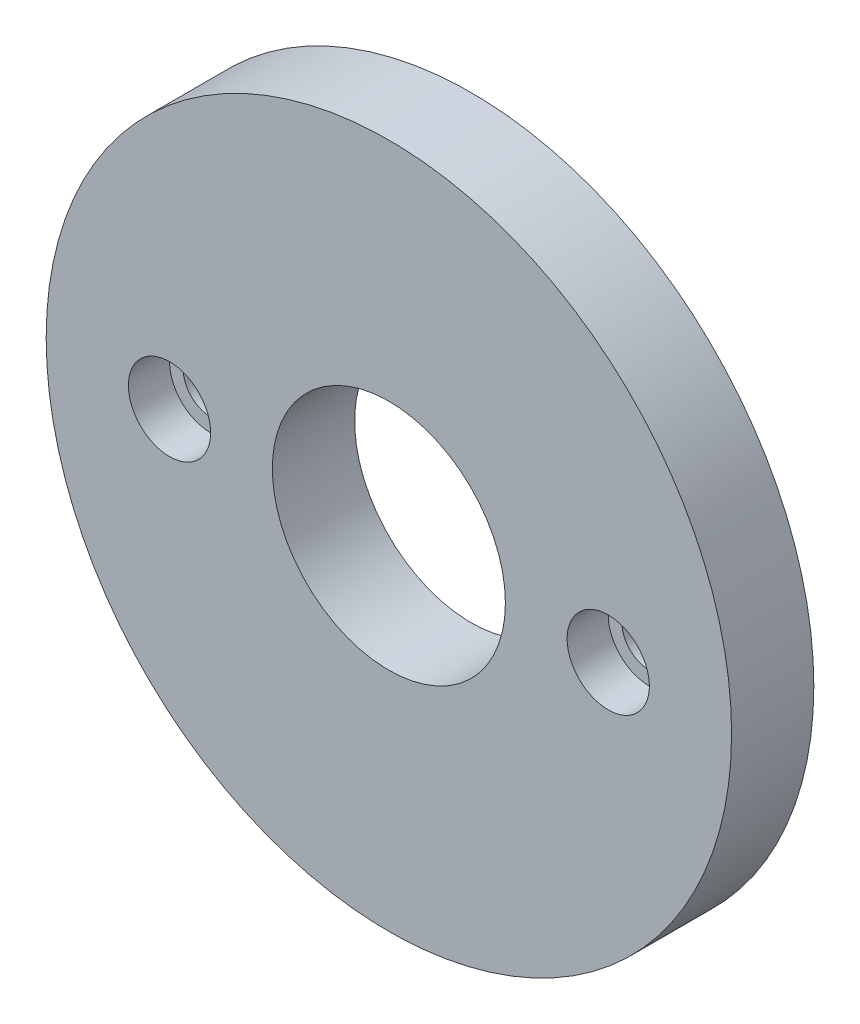
ISO-10303-21;
HEADER;
FILE_DESCRIPTION(('STEP AP214'),'2;1');
FILE_NAME('part.step','',(''),(''),'','','');
FILE_SCHEMA(('AUTOMOTIVE_DESIGN { 1 0 10303 214 1 1 1 1 }'));
ENDSEC;
DATA;
#1=APPLICATION_CONTEXT('core data for automotive mechanical design processes');
#2=APPLICATION_PROTOCOL_DEFINITION('international standard','automotive_design',2000,#1);
#3=PRODUCT_CONTEXT('',#1,'mechanical');
#4=PRODUCT('Part','Part','',(#3));
#5=PRODUCT_RELATED_PRODUCT_CATEGORY('part','',(#4));
#6=PRODUCT_DEFINITION_FORMATION('','',#4);
#7=PRODUCT_DEFINITION_CONTEXT('part definition',#1,'design');
#8=PRODUCT_DEFINITION('design','',#6,#7);
#9=PRODUCT_DEFINITION_SHAPE('','',#8);
#10=(LENGTH_UNIT() NAMED_UNIT(*) SI_UNIT(.MILLI.,.METRE.));
#11=(NAMED_UNIT(*) PLANE_ANGLE_UNIT() SI_UNIT($,.RADIAN.));
#12=(NAMED_UNIT(*) SI_UNIT($,.STERADIAN.) SOLID_ANGLE_UNIT());
#13=UNCERTAINTY_MEASURE_WITH_UNIT(LENGTH_MEASURE(1.E-05),#10,'distance_accuracy_value','');
#14=(GEOMETRIC_REPRESENTATION_CONTEXT(3) GLOBAL_UNCERTAINTY_ASSIGNED_CONTEXT((#13)) GLOBAL_UNIT_ASSIGNED_CONTEXT((#10,
#11,#12)) REPRESENTATION_CONTEXT('',''));
#15=CARTESIAN_POINT('',(0.,0.,0.));
#16=DIRECTION('',(0.,0.,1.));
#17=DIRECTION('',(1.,0.,0.));
#18=AXIS2_PLACEMENT_3D('',#15,#16,#17);
#19=CARTESIAN_POINT('',(0.,0.,5.99999999999999));
#20=DIRECTION('',(0.,0.,1.));
#21=DIRECTION('',(1.,0.,0.));
#22=AXIS2_PLACEMENT_3D('',#19,#20,#21);
#23=PLANE('',#22);
#24=CARTESIAN_POINT('',(-16.,0.,5.99999999999999));
#25=DIRECTION('',(0.,0.,1.));
#26=DIRECTION('',(1.,0.,0.));
#27=AXIS2_PLACEMENT_3D('',#24,#25,#26);
#28=CIRCLE('',#27,3.);
#29=CARTESIAN_POINT('',(-13.,0.,5.99999999999999));
#30=VERTEX_POINT('',#29);
#31=EDGE_CURVE('E72',#30,#30,#28,.T.);
#32=ORIENTED_EDGE('',*,*,#31,.F.);
#33=EDGE_LOOP('',(#32));
#34=FACE_BOUND('',#33,.T.);
#35=CARTESIAN_POINT('',(16.,0.,5.99999999999999));
#36=DIRECTION('',(0.,0.,1.));
#37=DIRECTION('',(-1.,0.,0.));
#38=AXIS2_PLACEMENT_3D('',#35,#36,#37);
#39=CIRCLE('',#38,2.99999999999999);
#40=CARTESIAN_POINT('',(13.,0.,5.99999999999999));
#41=VERTEX_POINT('',#40);
#42=EDGE_CURVE('E75',#41,#41,#39,.T.);
#43=ORIENTED_EDGE('',*,*,#42,.F.);
#44=EDGE_LOOP('',(#43));
#45=FACE_BOUND('',#44,.T.);
#46=CARTESIAN_POINT('',(0.,0.,5.99999999999999));
#47=DIRECTION('',(0.,0.,1.));
#48=DIRECTION('',(1.,0.,0.));
#49=AXIS2_PLACEMENT_3D('',#46,#47,#48);
#50=CIRCLE('',#49,25.);
#51=CARTESIAN_POINT('',(25.,0.,5.99999999999999));
#52=VERTEX_POINT('',#51);
#53=EDGE_CURVE('E10',#52,#52,#50,.T.);
#54=ORIENTED_EDGE('',*,*,#53,.T.);
#55=EDGE_LOOP('',(#54));
#56=FACE_BOUND('',#55,.T.);
#57=CARTESIAN_POINT('',(0.,0.,5.99999999999999));
#58=DIRECTION('',(0.,0.,1.));
#59=DIRECTION('',(1.,0.,0.));
#60=AXIS2_PLACEMENT_3D('',#57,#58,#59);
#61=CIRCLE('',#60,8.5);
#62=CARTESIAN_POINT('',(8.5,0.,5.99999999999999));
#63=VERTEX_POINT('',#62);
#64=EDGE_CURVE('E49',#63,#63,#61,.T.);
#65=ORIENTED_EDGE('',*,*,#64,.F.);
#66=EDGE_LOOP('',(#65));
#67=FACE_BOUND('',#66,.T.);
#68=ADVANCED_FACE('F36',(#34,#45,#56,#67),#23,.T.);
#69=CARTESIAN_POINT('',(0.,0.,0.));
#70=DIRECTION('',(0.,0.,1.));
#71=DIRECTION('',(1.,0.,0.));
#72=AXIS2_PLACEMENT_3D('',#69,#70,#71);
#73=PLANE('',#72);
#74=CARTESIAN_POINT('',(-16.,0.,0.));
#75=DIRECTION('',(0.,0.,1.));
#76=DIRECTION('',(1.,0.,0.));
#77=AXIS2_PLACEMENT_3D('',#74,#75,#76);
#78=CIRCLE('',#77,2.);
#79=CARTESIAN_POINT('',(-14.,0.,0.));
#80=VERTEX_POINT('',#79);
#81=EDGE_CURVE('E56',#80,#80,#78,.T.);
#82=ORIENTED_EDGE('',*,*,#81,.T.);
#83=EDGE_LOOP('',(#82));
#84=FACE_BOUND('',#83,.T.);
#85=CARTESIAN_POINT('',(16.,0.,0.));
#86=DIRECTION('',(0.,0.,1.));
#87=DIRECTION('',(1.,0.,0.));
#88=AXIS2_PLACEMENT_3D('',#85,#86,#87);
#89=CIRCLE('',#88,2.);
#90=CARTESIAN_POINT('',(18.,0.,0.));
#91=VERTEX_POINT('',#90);
#92=EDGE_CURVE('E64',#91,#91,#89,.T.);
#93=ORIENTED_EDGE('',*,*,#92,.T.);
#94=EDGE_LOOP('',(#93));
#95=FACE_BOUND('',#94,.T.);
#96=CARTESIAN_POINT('',(0.,0.,0.));
#97=DIRECTION('',(0.,0.,1.));
#98=DIRECTION('',(1.,0.,0.));
#99=AXIS2_PLACEMENT_3D('',#96,#97,#98);
#100=CIRCLE('',#99,25.);
#101=CARTESIAN_POINT('',(25.,0.,0.));
#102=VERTEX_POINT('',#101);
#103=EDGE_CURVE('E44',#102,#102,#100,.T.);
#104=ORIENTED_EDGE('',*,*,#103,.F.);
#105=EDGE_LOOP('',(#104));
#106=FACE_BOUND('',#105,.T.);
#107=CARTESIAN_POINT('',(0.,0.,0.));
#108=DIRECTION('',(0.,0.,1.));
#109=DIRECTION('',(1.,0.,0.));
#110=AXIS2_PLACEMENT_3D('',#107,#108,#109);
#111=CIRCLE('',#110,8.5);
#112=CARTESIAN_POINT('',(8.5,0.,0.));
#113=VERTEX_POINT('',#112);
#114=EDGE_CURVE('E52',#113,#113,#111,.T.);
#115=ORIENTED_EDGE('',*,*,#114,.T.);
#116=EDGE_LOOP('',(#115));
#117=FACE_BOUND('',#116,.T.);
#118=ADVANCED_FACE('F85',(#84,#95,#106,#117),#73,.F.);
#119=CARTESIAN_POINT('',(0.,0.,5.99999999999999));
#120=DIRECTION('',(0.,0.,-1.));
#121=DIRECTION('',(-1.,0.,0.));
#122=AXIS2_PLACEMENT_3D('',#119,#120,#121);
#123=CYLINDRICAL_SURFACE('',#122,25.);
#124=ORIENTED_EDGE('',*,*,#53,.F.);
#125=EDGE_LOOP('',(#124));
#126=FACE_BOUND('',#125,.T.);
#127=ORIENTED_EDGE('',*,*,#103,.T.);
#128=EDGE_LOOP('',(#127));
#129=FACE_BOUND('',#128,.T.);
#130=ADVANCED_FACE('F38',(#126,#129),#123,.T.);
#131=CARTESIAN_POINT('',(0.,0.,5.99999999999999));
#132=DIRECTION('',(0.,0.,-1.));
#133=DIRECTION('',(-1.,0.,0.));
#134=AXIS2_PLACEMENT_3D('',#131,#132,#133);
#135=CYLINDRICAL_SURFACE('',#134,8.5);
#136=ORIENTED_EDGE('',*,*,#64,.T.);
#137=EDGE_LOOP('',(#136));
#138=FACE_BOUND('',#137,.T.);
#139=ORIENTED_EDGE('',*,*,#114,.F.);
#140=EDGE_LOOP('',(#139));
#141=FACE_BOUND('',#140,.T.);
#142=ADVANCED_FACE('F87',(#138,#141),#135,.F.);
#143=CARTESIAN_POINT('',(16.,0.,2.99999999999999));
#144=DIRECTION('',(0.,0.,1.));
#145=DIRECTION('',(1.,0.,0.));
#146=AXIS2_PLACEMENT_3D('',#143,#144,#145);
#147=CYLINDRICAL_SURFACE('',#146,2.99999999999999);
#148=CARTESIAN_POINT('',(16.,0.,2.99999999999999));
#149=DIRECTION('',(0.,0.,1.));
#150=DIRECTION('',(-1.,0.,0.));
#151=AXIS2_PLACEMENT_3D('',#148,#149,#150);
#152=CIRCLE('',#151,2.99999999999999);
#153=CARTESIAN_POINT('',(13.,0.,2.99999999999999));
#154=VERTEX_POINT('',#153);
#155=EDGE_CURVE('E68',#154,#154,#152,.T.);
#156=ORIENTED_EDGE('',*,*,#155,.F.);
#157=EDGE_LOOP('',(#156));
#158=FACE_BOUND('',#157,.T.);
#159=ORIENTED_EDGE('',*,*,#42,.T.);
#160=EDGE_LOOP('',(#159));
#161=FACE_BOUND('',#160,.T.);
#162=ADVANCED_FACE('F89',(#158,#161),#147,.F.);
#163=CARTESIAN_POINT('',(16.,0.,2.99999999999999));
#164=DIRECTION('',(0.,0.,-1.));
#165=DIRECTION('',(-1.,0.,0.));
#166=AXIS2_PLACEMENT_3D('',#163,#164,#165);
#167=PLANE('',#166);
#168=CARTESIAN_POINT('',(16.,0.,2.99999999999999));
#169=DIRECTION('',(0.,0.,-1.));
#170=DIRECTION('',(-1.,0.,0.));
#171=AXIS2_PLACEMENT_3D('',#168,#169,#170);
#172=CIRCLE('',#171,2.);
#173=CARTESIAN_POINT('',(14.,0.,2.99999999999999));
#174=VERTEX_POINT('',#173);
#175=EDGE_CURVE('E40',#174,#174,#172,.T.);
#176=ORIENTED_EDGE('',*,*,#175,.T.);
#177=EDGE_LOOP('',(#176));
#178=FACE_BOUND('',#177,.T.);
#179=ORIENTED_EDGE('',*,*,#155,.T.);
#180=EDGE_LOOP('',(#179));
#181=FACE_BOUND('',#180,.T.);
#182=ADVANCED_FACE('F95',(#178,#181),#167,.F.);
#183=CARTESIAN_POINT('',(-16.,0.,2.99999999999999));
#184=DIRECTION('',(0.,0.,1.));
#185=DIRECTION('',(1.,0.,0.));
#186=AXIS2_PLACEMENT_3D('',#183,#184,#185);
#187=CYLINDRICAL_SURFACE('',#186,3.);
#188=CARTESIAN_POINT('',(-16.,0.,2.99999999999999));
#189=DIRECTION('',(0.,0.,1.));
#190=DIRECTION('',(1.,0.,0.));
#191=AXIS2_PLACEMENT_3D('',#188,#189,#190);
#192=CIRCLE('',#191,3.);
#193=CARTESIAN_POINT('',(-13.,0.,2.99999999999999));
#194=VERTEX_POINT('',#193);
#195=EDGE_CURVE('E69',#194,#194,#192,.T.);
#196=ORIENTED_EDGE('',*,*,#195,.F.);
#197=EDGE_LOOP('',(#196));
#198=FACE_BOUND('',#197,.T.);
#199=ORIENTED_EDGE('',*,*,#31,.T.);
#200=EDGE_LOOP('',(#199));
#201=FACE_BOUND('',#200,.T.);
#202=ADVANCED_FACE('F112',(#198,#201),#187,.F.);
#203=CARTESIAN_POINT('',(-16.,0.,2.99999999999999));
#204=DIRECTION('',(0.,0.,1.));
#205=DIRECTION('',(1.,0.,0.));
#206=AXIS2_PLACEMENT_3D('',#203,#204,#205);
#207=PLANE('',#206);
#208=CARTESIAN_POINT('',(-16.,0.,2.99999999999999));
#209=DIRECTION('',(0.,0.,1.));
#210=DIRECTION('',(1.,0.,0.));
#211=AXIS2_PLACEMENT_3D('',#208,#209,#210);
#212=CIRCLE('',#211,2.);
#213=CARTESIAN_POINT('',(-14.,0.,2.99999999999999));
#214=VERTEX_POINT('',#213);
#215=EDGE_CURVE('E54',#214,#214,#212,.T.);
#216=ORIENTED_EDGE('',*,*,#215,.F.);
#217=EDGE_LOOP('',(#216));
#218=FACE_BOUND('',#217,.T.);
#219=ORIENTED_EDGE('',*,*,#195,.T.);
#220=EDGE_LOOP('',(#219));
#221=FACE_BOUND('',#220,.T.);
#222=ADVANCED_FACE('F114',(#218,#221),#207,.T.);
#223=CARTESIAN_POINT('',(-16.,0.,-85.));
#224=DIRECTION('',(0.,0.,1.));
#225=DIRECTION('',(1.,0.,0.));
#226=AXIS2_PLACEMENT_3D('',#223,#224,#225);
#227=CYLINDRICAL_SURFACE('',#226,2.);
#228=ORIENTED_EDGE('',*,*,#215,.T.);
#229=EDGE_LOOP('',(#228));
#230=FACE_BOUND('',#229,.T.);
#231=ORIENTED_EDGE('',*,*,#81,.F.);
#232=EDGE_LOOP('',(#231));
#233=FACE_BOUND('',#232,.T.);
#234=ADVANCED_FACE('F121',(#230,#233),#227,.F.);
#235=CARTESIAN_POINT('',(16.,0.,-85.));
#236=DIRECTION('',(0.,0.,1.));
#237=DIRECTION('',(1.,0.,0.));
#238=AXIS2_PLACEMENT_3D('',#235,#236,#237);
#239=CYLINDRICAL_SURFACE('',#238,2.);
#240=ORIENTED_EDGE('',*,*,#175,.F.);
#241=EDGE_LOOP('',(#240));
#242=FACE_BOUND('',#241,.T.);
#243=ORIENTED_EDGE('',*,*,#92,.F.);
#244=EDGE_LOOP('',(#243));
#245=FACE_BOUND('',#244,.T.);
#246=ADVANCED_FACE('F127',(#242,#245),#239,.F.);
#247=CLOSED_SHELL('',(#68,#118,#130,#142,#162,#182,#202,#222,#234,#246));
#248=MANIFOLD_SOLID_BREP('B2',#247);
#249=ADVANCED_BREP_SHAPE_REPRESENTATION('',(#18,#248),#14);
#250=SHAPE_DEFINITION_REPRESENTATION(#9,#249);
ENDSEC;
END-ISO-10303-21;
